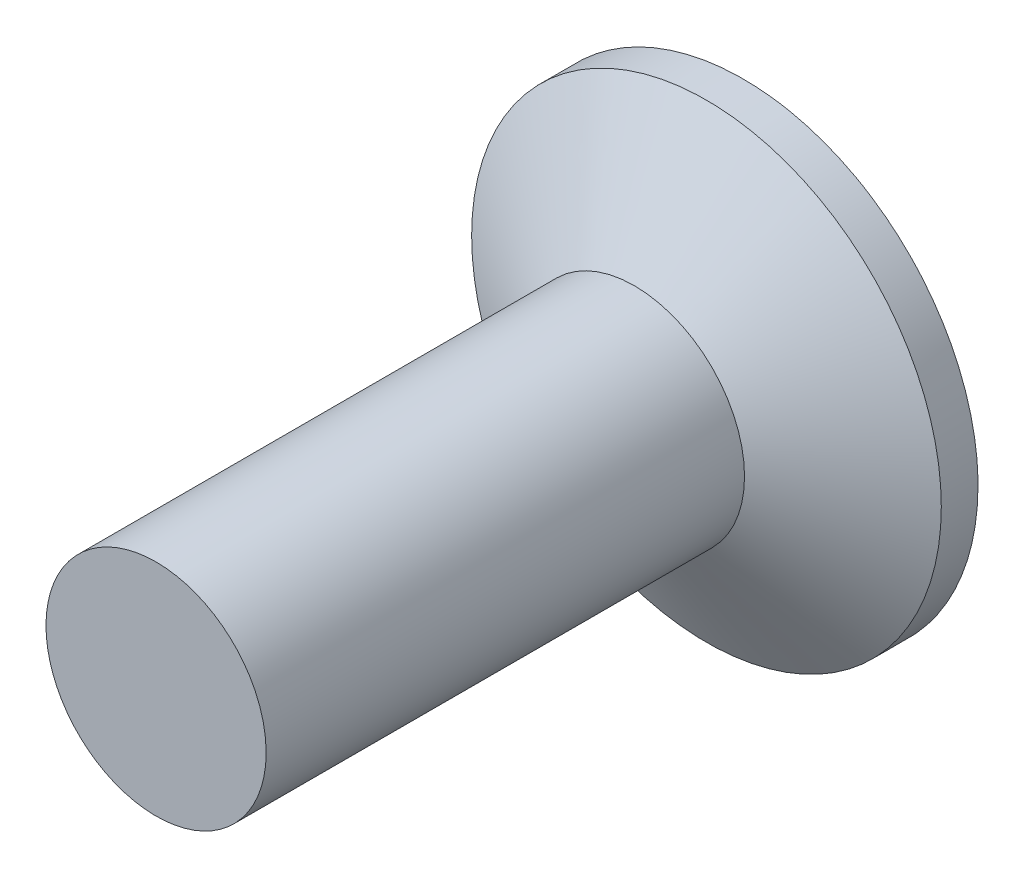
ISO-10303-21;
HEADER;
FILE_DESCRIPTION(('STEP AP214'),'2;1');
FILE_NAME('part.step','',(''),(''),'','','');
FILE_SCHEMA(('AUTOMOTIVE_DESIGN { 1 0 10303 214 1 1 1 1 }'));
ENDSEC;
DATA;
#1=APPLICATION_CONTEXT('core data for automotive mechanical design processes');
#2=APPLICATION_PROTOCOL_DEFINITION('international standard','automotive_design',2000,#1);
#3=PRODUCT_CONTEXT('',#1,'mechanical');
#4=PRODUCT('Part','Part','',(#3));
#5=PRODUCT_RELATED_PRODUCT_CATEGORY('part','',(#4));
#6=PRODUCT_DEFINITION_FORMATION('','',#4);
#7=PRODUCT_DEFINITION_CONTEXT('part definition',#1,'design');
#8=PRODUCT_DEFINITION('design','',#6,#7);
#9=PRODUCT_DEFINITION_SHAPE('','',#8);
#10=(LENGTH_UNIT() NAMED_UNIT(*) SI_UNIT(.MILLI.,.METRE.));
#11=(NAMED_UNIT(*) PLANE_ANGLE_UNIT() SI_UNIT($,.RADIAN.));
#12=(NAMED_UNIT(*) SI_UNIT($,.STERADIAN.) SOLID_ANGLE_UNIT());
#13=UNCERTAINTY_MEASURE_WITH_UNIT(LENGTH_MEASURE(1.E-05),#10,'distance_accuracy_value','');
#14=(GEOMETRIC_REPRESENTATION_CONTEXT(3) GLOBAL_UNCERTAINTY_ASSIGNED_CONTEXT((#13)) GLOBAL_UNIT_ASSIGNED_CONTEXT((#10,
#11,#12)) REPRESENTATION_CONTEXT('',''));
#15=CARTESIAN_POINT('',(0.,0.,0.));
#16=DIRECTION('',(0.,0.,1.));
#17=DIRECTION('',(1.,0.,0.));
#18=AXIS2_PLACEMENT_3D('',#15,#16,#17);
#19=CARTESIAN_POINT('',(1.25,-1.25,-7.));
#20=DIRECTION('',(0.,0.,-1.));
#21=DIRECTION('',(-1.,0.,0.));
#22=AXIS2_PLACEMENT_3D('',#19,#20,#21);
#23=PLANE('',#22);
#24=DIRECTION('',(1.,0.,0.));
#25=VECTOR('',#24,1.);
#26=CARTESIAN_POINT('',(-0.440139819,-1.25,-7.));
#27=LINE('',#26,#25);
#28=CARTESIAN_POINT('',(-0.4,-1.24999999999981,-7.));
#29=VERTEX_POINT('',#28);
#30=CARTESIAN_POINT('',(0.400000000000184,-1.25,-7.));
#31=VERTEX_POINT('',#30);
#32=EDGE_CURVE('E179',#29,#31,#27,.T.);
#33=ORIENTED_EDGE('',*,*,#32,.F.);
#34=DIRECTION('',(0.,1.,0.));
#35=VECTOR('',#34,1.);
#36=CARTESIAN_POINT('',(-0.4,-2.2611,-7.));
#37=LINE('',#36,#35);
#38=CARTESIAN_POINT('',(-0.4,-0.4,-7.));
#39=VERTEX_POINT('',#38);
#40=EDGE_CURVE('E187',#39,#29,#37,.F.);
#41=ORIENTED_EDGE('',*,*,#40,.F.);
#42=DIRECTION('',(1.,0.,0.));
#43=VECTOR('',#42,1.);
#44=CARTESIAN_POINT('',(-2.2611,-0.4,-7.));
#45=LINE('',#44,#43);
#46=CARTESIAN_POINT('',(-1.25,-0.400000000000184,-7.));
#47=VERTEX_POINT('',#46);
#48=EDGE_CURVE('E195',#47,#39,#45,.T.);
#49=ORIENTED_EDGE('',*,*,#48,.F.);
#50=DIRECTION('',(0.,1.,0.));
#51=VECTOR('',#50,1.);
#52=CARTESIAN_POINT('',(-1.25,-0.440139819,-7.));
#53=LINE('',#52,#51);
#54=CARTESIAN_POINT('',(-1.25,0.400000000000184,-7.));
#55=VERTEX_POINT('',#54);
#56=EDGE_CURVE('E112',#55,#47,#53,.F.);
#57=ORIENTED_EDGE('',*,*,#56,.F.);
#58=DIRECTION('',(1.,0.,0.));
#59=VECTOR('',#58,1.);
#60=CARTESIAN_POINT('',(-2.2611,0.4,-7.));
#61=LINE('',#60,#59);
#62=CARTESIAN_POINT('',(-0.4,0.4,-7.));
#63=VERTEX_POINT('',#62);
#64=EDGE_CURVE('E22',#63,#55,#61,.F.);
#65=ORIENTED_EDGE('',*,*,#64,.F.);
#66=DIRECTION('',(0.,1.,0.));
#67=VECTOR('',#66,1.);
#68=CARTESIAN_POINT('',(-0.4,0.3889,-7.));
#69=LINE('',#68,#67);
#70=CARTESIAN_POINT('',(-0.400000000000184,1.25,-7.));
#71=VERTEX_POINT('',#70);
#72=EDGE_CURVE('E109',#71,#63,#69,.F.);
#73=ORIENTED_EDGE('',*,*,#72,.F.);
#74=DIRECTION('',(1.,0.,0.));
#75=VECTOR('',#74,1.);
#76=CARTESIAN_POINT('',(-0.440139819,1.25,-7.));
#77=LINE('',#76,#75);
#78=CARTESIAN_POINT('',(0.4,1.24999999999981,-7.));
#79=VERTEX_POINT('',#78);
#80=EDGE_CURVE('E124',#79,#71,#77,.F.);
#81=ORIENTED_EDGE('',*,*,#80,.F.);
#82=DIRECTION('',(0.,1.,0.));
#83=VECTOR('',#82,1.);
#84=CARTESIAN_POINT('',(0.4,0.3889,-7.));
#85=LINE('',#84,#83);
#86=CARTESIAN_POINT('',(0.4,0.4,-7.));
#87=VERTEX_POINT('',#86);
#88=EDGE_CURVE('E139',#87,#79,#85,.T.);
#89=ORIENTED_EDGE('',*,*,#88,.F.);
#90=DIRECTION('',(1.,0.,0.));
#91=VECTOR('',#90,1.);
#92=CARTESIAN_POINT('',(0.3889,0.4,-7.));
#93=LINE('',#92,#91);
#94=CARTESIAN_POINT('',(1.25,0.400000000000184,-7.));
#95=VERTEX_POINT('',#94);
#96=EDGE_CURVE('E147',#95,#87,#93,.F.);
#97=ORIENTED_EDGE('',*,*,#96,.F.);
#98=DIRECTION('',(0.,1.,0.));
#99=VECTOR('',#98,1.);
#100=CARTESIAN_POINT('',(1.25,-0.440139819,-7.));
#101=LINE('',#100,#99);
#102=CARTESIAN_POINT('',(1.24999999999981,-0.4,-7.));
#103=VERTEX_POINT('',#102);
#104=EDGE_CURVE('E155',#103,#95,#101,.T.);
#105=ORIENTED_EDGE('',*,*,#104,.F.);
#106=DIRECTION('',(1.,0.,0.));
#107=VECTOR('',#106,1.);
#108=CARTESIAN_POINT('',(0.3889,-0.4,-7.));
#109=LINE('',#108,#107);
#110=CARTESIAN_POINT('',(0.4,-0.4,-7.));
#111=VERTEX_POINT('',#110);
#112=EDGE_CURVE('E163',#111,#103,#109,.T.);
#113=ORIENTED_EDGE('',*,*,#112,.F.);
#114=DIRECTION('',(0.,1.,0.));
#115=VECTOR('',#114,1.);
#116=CARTESIAN_POINT('',(0.4,-2.2611,-7.));
#117=LINE('',#116,#115);
#118=EDGE_CURVE('E171',#31,#111,#117,.T.);
#119=ORIENTED_EDGE('',*,*,#118,.F.);
#120=EDGE_LOOP('',(#33,#41,#49,#57,#65,#73,#81,#89,#97,#105,#113,#119));
#121=FACE_BOUND('',#120,.T.);
#122=ADVANCED_FACE('F17',(#121),#23,.T.);
#123=CARTESIAN_POINT('',(-2.2611,0.4,-7.));
#124=DIRECTION('',(0.,-0.999390827036237,-0.0348994962116514));
#125=DIRECTION('',(0.,0.0348994962116514,-0.999390827036237));
#126=AXIS2_PLACEMENT_3D('',#123,#124,#125);
#127=PLANE('',#126);
#128=ORIENTED_EDGE('',*,*,#64,.T.);
#129=DIRECTION('',(0.70689130758923,-0.0246851880604071,0.70689130758923));
#130=VECTOR('',#129,1.);
#131=CARTESIAN_POINT('',(-2.25000000000954,0.434920769000666,-8.00000000000954));
#132=LINE('',#131,#130);
#133=CARTESIAN_POINT('',(-2.25000000043532,0.434920769015452,-8.00000000043532));
#134=VERTEX_POINT('',#133);
#135=EDGE_CURVE('E202',#134,#55,#132,.T.);
#136=ORIENTED_EDGE('',*,*,#135,.F.);
#137=DIRECTION('',(1.,0.,0.));
#138=VECTOR('',#137,1.);
#139=CARTESIAN_POINT('',(-2.2611,0.43492076899688,-7.99999999991066));
#140=LINE('',#139,#138);
#141=CARTESIAN_POINT('',(-0.43492076899688,0.43492076899688,-7.99999999991066));
#142=VERTEX_POINT('',#141);
#143=EDGE_CURVE('E120',#134,#142,#140,.T.);
#144=ORIENTED_EDGE('',*,*,#143,.T.);
#145=DIRECTION('',(-0.0348782622524204,0.03487826225242,-0.998782765992937));
#146=VECTOR('',#145,1.);
#147=CARTESIAN_POINT('',(-0.400000000000558,0.400000000000559,-7.00000000001598));
#148=LINE('',#147,#146);
#149=EDGE_CURVE('E117',#63,#142,#148,.T.);
#150=ORIENTED_EDGE('',*,*,#149,.F.);
#151=EDGE_LOOP('',(#128,#136,#144,#150));
#152=FACE_BOUND('',#151,.T.);
#153=ADVANCED_FACE('F118',(#152),#127,.T.);
#154=CARTESIAN_POINT('',(-0.4,0.3889,-7.));
#155=DIRECTION('',(0.999390827036237,0.,-0.0348994962116514));
#156=DIRECTION('',(-0.0348994962116514,0.,-0.999390827036237));
#157=AXIS2_PLACEMENT_3D('',#154,#155,#156);
#158=PLANE('',#157);
#159=ORIENTED_EDGE('',*,*,#72,.T.);
#160=ORIENTED_EDGE('',*,*,#149,.T.);
#161=DIRECTION('',(0.,1.,0.));
#162=VECTOR('',#161,1.);
#163=CARTESIAN_POINT('',(-0.43492076899688,0.3889,-7.99999999991066));
#164=LINE('',#163,#162);
#165=CARTESIAN_POINT('',(-0.434920769015452,2.25000000043532,-8.00000000043532));
#166=VERTEX_POINT('',#165);
#167=EDGE_CURVE('E212',#142,#166,#164,.T.);
#168=ORIENTED_EDGE('',*,*,#167,.T.);
#169=DIRECTION('',(-0.0246851880604071,0.70689130758923,-0.70689130758923));
#170=VECTOR('',#169,1.);
#171=CARTESIAN_POINT('',(-0.400000000000735,1.25000000001053,-7.00000000001053));
#172=LINE('',#171,#170);
#173=EDGE_CURVE('E128',#71,#166,#172,.T.);
#174=ORIENTED_EDGE('',*,*,#173,.F.);
#175=EDGE_LOOP('',(#159,#160,#168,#174));
#176=FACE_BOUND('',#175,.T.);
#177=ADVANCED_FACE('F126',(#176),#158,.T.);
#178=CARTESIAN_POINT('',(-0.440139819,1.25,-7.));
#179=DIRECTION('',(0.,-0.707106781186548,-0.707106781186547));
#180=DIRECTION('',(0.,0.707106781186547,-0.707106781186548));
#181=AXIS2_PLACEMENT_3D('',#178,#179,#180);
#182=PLANE('',#181);
#183=ORIENTED_EDGE('',*,*,#80,.T.);
#184=ORIENTED_EDGE('',*,*,#173,.T.);
#185=DIRECTION('',(1.,0.,0.));
#186=VECTOR('',#185,1.);
#187=CARTESIAN_POINT('',(-0.440139819,2.25000000096,-8.00000000096));
#188=LINE('',#187,#186);
#189=CARTESIAN_POINT('',(0.434920769015204,2.25000000043515,-8.00000000043536));
#190=VERTEX_POINT('',#189);
#191=EDGE_CURVE('E215',#166,#190,#188,.T.);
#192=ORIENTED_EDGE('',*,*,#191,.T.);
#193=DIRECTION('',(0.0246851880604302,0.706891307589264,-0.706891307589195));
#194=VECTOR('',#193,1.);
#195=CARTESIAN_POINT('',(0.399999999989177,1.2499999996897,-6.99999999969008));
#196=LINE('',#195,#194);
#197=EDGE_CURVE('E143',#79,#190,#196,.T.);
#198=ORIENTED_EDGE('',*,*,#197,.F.);
#199=EDGE_LOOP('',(#183,#184,#192,#198));
#200=FACE_BOUND('',#199,.T.);
#201=ADVANCED_FACE('F437',(#200),#182,.T.);
#202=CARTESIAN_POINT('',(0.434920769,0.3889,-8.));
#203=DIRECTION('',(-0.999390827036237,0.,-0.0348994962116514));
#204=DIRECTION('',(-0.0348994962116514,0.,0.999390827036237));
#205=AXIS2_PLACEMENT_3D('',#202,#203,#204);
#206=PLANE('',#205);
#207=ORIENTED_EDGE('',*,*,#88,.T.);
#208=ORIENTED_EDGE('',*,*,#197,.T.);
#209=DIRECTION('',(0.,1.,0.));
#210=VECTOR('',#209,1.);
#211=CARTESIAN_POINT('',(0.43492076899688,0.3889,-7.99999999991066));
#212=LINE('',#211,#210);
#213=CARTESIAN_POINT('',(0.43492076899688,0.43492076899688,-7.99999999991066));
#214=VERTEX_POINT('',#213);
#215=EDGE_CURVE('E218',#190,#214,#212,.F.);
#216=ORIENTED_EDGE('',*,*,#215,.T.);
#217=DIRECTION('',(0.03487826225242,0.0348782622524204,-0.998782765992937));
#218=VECTOR('',#217,1.);
#219=CARTESIAN_POINT('',(0.400000000000559,0.400000000000558,-7.00000000001598));
#220=LINE('',#219,#218);
#221=EDGE_CURVE('E151',#87,#214,#220,.T.);
#222=ORIENTED_EDGE('',*,*,#221,.F.);
#223=EDGE_LOOP('',(#207,#208,#216,#222));
#224=FACE_BOUND('',#223,.T.);
#225=ADVANCED_FACE('F426',(#224),#206,.T.);
#226=CARTESIAN_POINT('',(0.3889,0.4,-7.));
#227=DIRECTION('',(0.,-0.999390827036237,-0.0348994962116514));
#228=DIRECTION('',(0.,0.0348994962116514,-0.999390827036237));
#229=AXIS2_PLACEMENT_3D('',#226,#227,#228);
#230=PLANE('',#229);
#231=ORIENTED_EDGE('',*,*,#96,.T.);
#232=ORIENTED_EDGE('',*,*,#221,.T.);
#233=DIRECTION('',(1.,0.,0.));
#234=VECTOR('',#233,1.);
#235=CARTESIAN_POINT('',(0.3889,0.43492076899688,-7.99999999991066));
#236=LINE('',#235,#234);
#237=CARTESIAN_POINT('',(2.25000000043532,0.434920769015452,-8.00000000043532));
#238=VERTEX_POINT('',#237);
#239=EDGE_CURVE('E221',#214,#238,#236,.T.);
#240=ORIENTED_EDGE('',*,*,#239,.T.);
#241=DIRECTION('',(0.70689130758923,0.0246851880604071,-0.70689130758923));
#242=VECTOR('',#241,1.);
#243=CARTESIAN_POINT('',(1.25000000001053,0.400000000000735,-7.00000000001053));
#244=LINE('',#243,#242);
#245=EDGE_CURVE('E159',#95,#238,#244,.T.);
#246=ORIENTED_EDGE('',*,*,#245,.F.);
#247=EDGE_LOOP('',(#231,#232,#240,#246));
#248=FACE_BOUND('',#247,.T.);
#249=ADVANCED_FACE('F415',(#248),#230,.T.);
#250=CARTESIAN_POINT('',(2.25,-0.440139819,-8.));
#251=DIRECTION('',(-0.707106781186548,0.,-0.707106781186547));
#252=DIRECTION('',(-0.707106781186547,0.,0.707106781186548));
#253=AXIS2_PLACEMENT_3D('',#250,#251,#252);
#254=PLANE('',#253);
#255=ORIENTED_EDGE('',*,*,#104,.T.);
#256=ORIENTED_EDGE('',*,*,#245,.T.);
#257=DIRECTION('',(0.,1.,0.));
#258=VECTOR('',#257,1.);
#259=CARTESIAN_POINT('',(2.25000000096,-0.440139819,-8.00000000096));
#260=LINE('',#259,#258);
#261=CARTESIAN_POINT('',(2.25000000043515,-0.434920769015204,-8.00000000043536));
#262=VERTEX_POINT('',#261);
#263=EDGE_CURVE('E224',#238,#262,#260,.F.);
#264=ORIENTED_EDGE('',*,*,#263,.T.);
#265=DIRECTION('',(0.706891307589264,-0.0246851880604302,-0.706891307589195));
#266=VECTOR('',#265,1.);
#267=CARTESIAN_POINT('',(1.2499999996897,-0.399999999989177,-6.99999999969008));
#268=LINE('',#267,#266);
#269=EDGE_CURVE('E167',#103,#262,#268,.T.);
#270=ORIENTED_EDGE('',*,*,#269,.F.);
#271=EDGE_LOOP('',(#255,#256,#264,#270));
#272=FACE_BOUND('',#271,.T.);
#273=ADVANCED_FACE('F404',(#272),#254,.T.);
#274=CARTESIAN_POINT('',(0.3889,-0.434920769,-8.));
#275=DIRECTION('',(0.,0.999390827036237,-0.0348994962116514));
#276=DIRECTION('',(0.,0.0348994962116514,0.999390827036237));
#277=AXIS2_PLACEMENT_3D('',#274,#275,#276);
#278=PLANE('',#277);
#279=ORIENTED_EDGE('',*,*,#112,.T.);
#280=ORIENTED_EDGE('',*,*,#269,.T.);
#281=DIRECTION('',(1.,0.,0.));
#282=VECTOR('',#281,1.);
#283=CARTESIAN_POINT('',(0.3889,-0.43492076899688,-7.99999999991066));
#284=LINE('',#283,#282);
#285=CARTESIAN_POINT('',(0.43492076899688,-0.43492076899688,-7.99999999991066));
#286=VERTEX_POINT('',#285);
#287=EDGE_CURVE('E227',#262,#286,#284,.F.);
#288=ORIENTED_EDGE('',*,*,#287,.T.);
#289=DIRECTION('',(0.0348782622524204,-0.0348782622524201,-0.998782765992937));
#290=VECTOR('',#289,1.);
#291=CARTESIAN_POINT('',(0.400000000000558,-0.400000000000559,-7.00000000001598));
#292=LINE('',#291,#290);
#293=EDGE_CURVE('E175',#111,#286,#292,.T.);
#294=ORIENTED_EDGE('',*,*,#293,.F.);
#295=EDGE_LOOP('',(#279,#280,#288,#294));
#296=FACE_BOUND('',#295,.T.);
#297=ADVANCED_FACE('F393',(#296),#278,.T.);
#298=CARTESIAN_POINT('',(0.434920769,-2.2611,-8.));
#299=DIRECTION('',(-0.999390827036237,0.,-0.0348994962116514));
#300=DIRECTION('',(-0.0348994962116514,0.,0.999390827036237));
#301=AXIS2_PLACEMENT_3D('',#298,#299,#300);
#302=PLANE('',#301);
#303=ORIENTED_EDGE('',*,*,#118,.T.);
#304=ORIENTED_EDGE('',*,*,#293,.T.);
#305=DIRECTION('',(0.,1.,0.));
#306=VECTOR('',#305,1.);
#307=CARTESIAN_POINT('',(0.43492076899688,-2.2611,-7.99999999991066));
#308=LINE('',#307,#306);
#309=CARTESIAN_POINT('',(0.434920769015452,-2.25000000043532,-8.00000000043532));
#310=VERTEX_POINT('',#309);
#311=EDGE_CURVE('E230',#286,#310,#308,.F.);
#312=ORIENTED_EDGE('',*,*,#311,.T.);
#313=DIRECTION('',(0.0246851880604071,-0.70689130758923,-0.70689130758923));
#314=VECTOR('',#313,1.);
#315=CARTESIAN_POINT('',(0.400000000000735,-1.25000000001053,-7.00000000001053));
#316=LINE('',#315,#314);
#317=EDGE_CURVE('E183',#31,#310,#316,.T.);
#318=ORIENTED_EDGE('',*,*,#317,.F.);
#319=EDGE_LOOP('',(#303,#304,#312,#318));
#320=FACE_BOUND('',#319,.T.);
#321=ADVANCED_FACE('F382',(#320),#302,.T.);
#322=CARTESIAN_POINT('',(-0.440139819,-2.25,-8.));
#323=DIRECTION('',(0.,0.707106781186548,-0.707106781186547));
#324=DIRECTION('',(0.,0.707106781186547,0.707106781186548));
#325=AXIS2_PLACEMENT_3D('',#322,#323,#324);
#326=PLANE('',#325);
#327=ORIENTED_EDGE('',*,*,#32,.T.);
#328=ORIENTED_EDGE('',*,*,#317,.T.);
#329=DIRECTION('',(1.,0.,0.));
#330=VECTOR('',#329,1.);
#331=CARTESIAN_POINT('',(-0.440139819,-2.25000000096,-8.00000000096));
#332=LINE('',#331,#330);
#333=CARTESIAN_POINT('',(-0.434920769015204,-2.25000000043515,-8.00000000043536));
#334=VERTEX_POINT('',#333);
#335=EDGE_CURVE('E233',#310,#334,#332,.F.);
#336=ORIENTED_EDGE('',*,*,#335,.T.);
#337=DIRECTION('',(-0.0246851880604302,-0.706891307589264,-0.706891307589195));
#338=VECTOR('',#337,1.);
#339=CARTESIAN_POINT('',(-0.399999999989177,-1.2499999996897,-6.99999999969008));
#340=LINE('',#339,#338);
#341=EDGE_CURVE('E191',#29,#334,#340,.T.);
#342=ORIENTED_EDGE('',*,*,#341,.F.);
#343=EDGE_LOOP('',(#327,#328,#336,#342));
#344=FACE_BOUND('',#343,.T.);
#345=ADVANCED_FACE('F371',(#344),#326,.T.);
#346=CARTESIAN_POINT('',(-0.4,-2.2611,-7.));
#347=DIRECTION('',(0.999390827036237,0.,-0.0348994962116514));
#348=DIRECTION('',(-0.0348994962116514,0.,-0.999390827036237));
#349=AXIS2_PLACEMENT_3D('',#346,#347,#348);
#350=PLANE('',#349);
#351=ORIENTED_EDGE('',*,*,#40,.T.);
#352=ORIENTED_EDGE('',*,*,#341,.T.);
#353=DIRECTION('',(0.,1.,0.));
#354=VECTOR('',#353,1.);
#355=CARTESIAN_POINT('',(-0.43492076899688,-2.2611,-7.99999999991066));
#356=LINE('',#355,#354);
#357=CARTESIAN_POINT('',(-0.43492076899688,-0.43492076899688,-7.99999999991066));
#358=VERTEX_POINT('',#357);
#359=EDGE_CURVE('E236',#334,#358,#356,.T.);
#360=ORIENTED_EDGE('',*,*,#359,.T.);
#361=DIRECTION('',(-0.0348782622524201,-0.0348782622524204,-0.998782765992937));
#362=VECTOR('',#361,1.);
#363=CARTESIAN_POINT('',(-0.400000000000559,-0.400000000000558,-7.00000000001598));
#364=LINE('',#363,#362);
#365=EDGE_CURVE('E199',#39,#358,#364,.T.);
#366=ORIENTED_EDGE('',*,*,#365,.F.);
#367=EDGE_LOOP('',(#351,#352,#360,#366));
#368=FACE_BOUND('',#367,.T.);
#369=ADVANCED_FACE('F361',(#368),#350,.T.);
#370=CARTESIAN_POINT('',(-2.2611,-0.434920769,-8.));
#371=DIRECTION('',(0.,0.999390827036237,-0.0348994962116514));
#372=DIRECTION('',(0.,0.0348994962116514,0.999390827036237));
#373=AXIS2_PLACEMENT_3D('',#370,#371,#372);
#374=PLANE('',#373);
#375=ORIENTED_EDGE('',*,*,#48,.T.);
#376=ORIENTED_EDGE('',*,*,#365,.T.);
#377=DIRECTION('',(1.,0.,0.));
#378=VECTOR('',#377,1.);
#379=CARTESIAN_POINT('',(-2.2611,-0.43492076899688,-7.99999999991066));
#380=LINE('',#379,#378);
#381=CARTESIAN_POINT('',(-2.25000000043532,-0.434920769015452,-8.00000000043532));
#382=VERTEX_POINT('',#381);
#383=EDGE_CURVE('E38',#358,#382,#380,.F.);
#384=ORIENTED_EDGE('',*,*,#383,.T.);
#385=DIRECTION('',(-0.70689130758923,-0.0246851880604071,-0.70689130758923));
#386=VECTOR('',#385,1.);
#387=CARTESIAN_POINT('',(-1.25000000001053,-0.400000000000735,-7.00000000001053));
#388=LINE('',#387,#386);
#389=EDGE_CURVE('E207',#47,#382,#388,.T.);
#390=ORIENTED_EDGE('',*,*,#389,.F.);
#391=EDGE_LOOP('',(#375,#376,#384,#390));
#392=FACE_BOUND('',#391,.T.);
#393=ADVANCED_FACE('F350',(#392),#374,.T.);
#394=CARTESIAN_POINT('',(-1.25,-0.440139819,-7.));
#395=DIRECTION('',(0.707106781186548,0.,-0.707106781186547));
#396=DIRECTION('',(-0.707106781186547,0.,-0.707106781186548));
#397=AXIS2_PLACEMENT_3D('',#394,#395,#396);
#398=PLANE('',#397);
#399=ORIENTED_EDGE('',*,*,#56,.T.);
#400=ORIENTED_EDGE('',*,*,#389,.T.);
#401=DIRECTION('',(0.,1.,0.));
#402=VECTOR('',#401,1.);
#403=CARTESIAN_POINT('',(-2.25000000096,-0.440139819,-8.00000000096));
#404=LINE('',#403,#402);
#405=EDGE_CURVE('E241',#382,#134,#404,.T.);
#406=ORIENTED_EDGE('',*,*,#405,.T.);
#407=ORIENTED_EDGE('',*,*,#135,.T.);
#408=EDGE_LOOP('',(#399,#400,#406,#407));
#409=FACE_BOUND('',#408,.T.);
#410=ADVANCED_FACE('F330',(#409),#398,.T.);
#411=CARTESIAN_POINT('',(-3.2384,-3.2384,-8.));
#412=DIRECTION('',(0.,0.,1.));
#413=DIRECTION('',(1.,0.,0.));
#414=AXIS2_PLACEMENT_3D('',#411,#412,#413);
#415=PLANE('',#414);
#416=ORIENTED_EDGE('',*,*,#383,.F.);
#417=ORIENTED_EDGE('',*,*,#359,.F.);
#418=ORIENTED_EDGE('',*,*,#335,.F.);
#419=ORIENTED_EDGE('',*,*,#311,.F.);
#420=ORIENTED_EDGE('',*,*,#287,.F.);
#421=ORIENTED_EDGE('',*,*,#263,.F.);
#422=ORIENTED_EDGE('',*,*,#239,.F.);
#423=ORIENTED_EDGE('',*,*,#215,.F.);
#424=ORIENTED_EDGE('',*,*,#191,.F.);
#425=ORIENTED_EDGE('',*,*,#167,.F.);
#426=ORIENTED_EDGE('',*,*,#143,.F.);
#427=ORIENTED_EDGE('',*,*,#405,.F.);
#428=EDGE_LOOP('',(#416,#417,#418,#419,#420,#421,#422,#423,#424,#425,#426,#427));
#429=FACE_BOUND('',#428,.T.);
#430=CARTESIAN_POINT('',(-3.2,-8.75108304731578E-10,-8.));
#431=CARTESIAN_POINT('',(-3.19999984525004,0.0846791863644175,-8.));
#432=CARTESIAN_POINT('',(-3.19663668450986,0.169361636344775,-8.));
#433=CARTESIAN_POINT('',(-3.183204827809,0.338203412008162,-8.));
#434=CARTESIAN_POINT('',(-3.17313508443994,0.422362653906021,-8.));
#435=CARTESIAN_POINT('',(-3.14633491914527,0.589713862698114,-8.));
#436=CARTESIAN_POINT('',(-3.12959721783843,0.672904669862015,-8.));
#437=CARTESIAN_POINT('',(-3.08956318292945,0.83773887714193,-8.));
#438=CARTESIAN_POINT('',(-3.06626197857292,0.919381079836477,-8.));
#439=CARTESIAN_POINT('',(-2.98679185625932,1.16091773329018,-8.));
#440=CARTESIAN_POINT('',(-2.92100226159444,1.31775856997783,-8.));
#441=CARTESIAN_POINT('',(-2.76539962041665,1.61904813748785,-8.));
#442=CARTESIAN_POINT('',(-2.6755839656687,1.76349552064459,-8.));
#443=CARTESIAN_POINT('',(-2.5215604716276,1.97227196741618,-8.));
#444=CARTESIAN_POINT('',(-2.46508135066165,2.04241992880516,-8.));
#445=CARTESIAN_POINT('',(-2.34645532476992,2.17766476701007,-8.));
#446=CARTESIAN_POINT('',(-2.28431336912342,2.24276596427875,-8.));
#447=CARTESIAN_POINT('',(-2.15472976021935,2.3675372900551,-8.));
#448=CARTESIAN_POINT('',(-2.08728521532328,2.42720441640709,-8.));
#449=CARTESIAN_POINT('',(-1.94761726390899,2.5406484385297,-8.));
#450=CARTESIAN_POINT('',(-1.87539286087006,2.59442409978328,-8.));
#451=CARTESIAN_POINT('',(-1.65233949439999,2.74627865197905,-8.));
#452=CARTESIAN_POINT('',(-1.49498794915848,2.83502199354484,-8.));
#453=CARTESIAN_POINT('',(-1.16770862890479,2.98477584912471,-8.));
#454=CARTESIAN_POINT('',(-0.997781345360795,3.0457874462489,-8.));
#455=CARTESIAN_POINT('',(-0.650072087515443,3.13843271987964,-8.));
#456=CARTESIAN_POINT('',(-0.472289979597575,3.17006589643527,-8.));
#457=CARTESIAN_POINT('',(-0.113937408000419,3.20302891299845,-8.));
#458=CARTESIAN_POINT('',(0.0666330696910646,3.20435860067442,-8.));
#459=CARTESIAN_POINT('',(0.425412285287806,3.1766986290034,-8.));
#460=CARTESIAN_POINT('',(0.603621037633741,3.14770915512842,-8.));
#461=CARTESIAN_POINT('',(0.952727170097578,3.06017134111305,-8.));
#462=CARTESIAN_POINT('',(1.1236244975075,3.00162278792054,-8.));
#463=CARTESIAN_POINT('',(1.37062911572051,2.89301045408224,-8.));
#464=CARTESIAN_POINT('',(1.45144647144706,2.85331550763776,-8.));
#465=CARTESIAN_POINT('',(1.60945417724931,2.7672616179373,-8.));
#466=CARTESIAN_POINT('',(1.68664536181441,2.72090421797653,-8.));
#467=CARTESIAN_POINT('',(1.83681299137271,2.62187045762943,-8.));
#468=CARTESIAN_POINT('',(1.90979125116749,2.56919684862443,-8.));
#469=CARTESIAN_POINT('',(2.05110986010195,2.45785620577202,-8.));
#470=CARTESIAN_POINT('',(2.11944567108347,2.39918344395976,-8.));
#471=CARTESIAN_POINT('',(2.31657264529379,2.21489855479154,-8.));
#472=CARTESIAN_POINT('',(2.43768420045432,2.08088708377243,-8.));
#473=CARTESIAN_POINT('',(2.65564900677017,1.79441378715886,-8.));
#474=CARTESIAN_POINT('',(2.75250300664237,1.64195253123816,-8.));
#475=CARTESIAN_POINT('',(2.877573456043,1.4027533364518,-8.));
#476=CARTESIAN_POINT('',(2.91592640446954,1.32117289151915,-8.));
#477=CARTESIAN_POINT('',(2.98559744721644,1.15511793382554,-8.));
#478=CARTESIAN_POINT('',(3.01692141646407,1.07064590647546,-8.));
#479=CARTESIAN_POINT('',(3.07229981382065,0.899477138190644,-8.));
#480=CARTESIAN_POINT('',(3.09636341516206,0.812783355982363,-8.));
#481=CARTESIAN_POINT('',(3.13710470058824,0.637690791031622,-8.));
#482=CARTESIAN_POINT('',(3.15378387319875,0.549292355659339,-8.));
#483=CARTESIAN_POINT('',(3.17779066587543,0.384157675594623,-8.));
#484=CARTESIAN_POINT('',(3.18611557914713,0.307564656253998,-8.));
#485=CARTESIAN_POINT('',(3.19722012487431,0.153981971772259,-8.));
#486=CARTESIAN_POINT('',(3.20000014072801,0.0769923344241154,-8.));
#487=CARTESIAN_POINT('',(3.19999984522181,-0.0846791874314702,-8.));
#488=CARTESIAN_POINT('',(3.19663668445338,-0.169361637410942,-8.));
#489=CARTESIAN_POINT('',(3.18320482769616,-0.338203413070272,-8.));
#490=CARTESIAN_POINT('',(3.173135084299,-0.422362654964959,-8.));
#491=CARTESIAN_POINT('',(3.14633491894848,-0.58971386374804,-8.));
#492=CARTESIAN_POINT('',(3.12959721761393,-0.672904670906101,-8.));
#493=CARTESIAN_POINT('',(3.08956318265009,-0.837738878172202,-8.));
#494=CARTESIAN_POINT('',(3.0662619782664,-0.91938108085877,-8.));
#495=CARTESIAN_POINT('',(2.98679185587234,-1.16091773428579,-8.));
#496=CARTESIAN_POINT('',(2.92100226115518,-1.31775857095151,-8.));
#497=CARTESIAN_POINT('',(2.76539961987696,-1.61904813840966,-8.));
#498=CARTESIAN_POINT('',(2.67558396508087,-1.76349552153646,-8.));
#499=CARTESIAN_POINT('',(2.52156047097017,-1.97227196825671,-8.));
#500=CARTESIAN_POINT('',(2.46508134998083,-2.04241992962688,-8.));
#501=CARTESIAN_POINT('',(2.346455324044,-2.17766476779226,-8.));
#502=CARTESIAN_POINT('',(2.28431336837579,-2.24276596504023,-8.));
#503=CARTESIAN_POINT('',(2.15472975943012,-2.36753729077339,-8.));
#504=CARTESIAN_POINT('',(2.08728521451417,-2.42720441710288,-8.));
#505=CARTESIAN_POINT('',(1.94761726306209,-2.54064843917892,-8.));
#506=CARTESIAN_POINT('',(1.87539286000524,-2.59442410040842,-8.));
#507=CARTESIAN_POINT('',(1.65233949348457,-2.74627865252982,-8.));
#508=CARTESIAN_POINT('',(1.49498794821348,-2.83502199404317,-8.));
#509=CARTESIAN_POINT('',(1.16770862790988,-2.98477584951394,-8.));
#510=CARTESIAN_POINT('',(0.997781344345537,-3.0457874465815,-8.));
#511=CARTESIAN_POINT('',(0.650072086469299,-3.13843272009633,-8.));
#512=CARTESIAN_POINT('',(0.472289978540886,-3.1700658965927,-8.));
#513=CARTESIAN_POINT('',(0.113937406932742,-3.20302891303643,-8.));
#514=CARTESIAN_POINT('',(-0.0666330707591834,-3.20435860065221,-8.));
#515=CARTESIAN_POINT('',(-0.4254122863467,-3.1766986288616,-8.));
#516=CARTESIAN_POINT('',(-0.603621038682968,-3.14770915492722,-8.));
#517=CARTESIAN_POINT('',(-0.952727171117624,-3.06017134079548,-8.));
#518=CARTESIAN_POINT('',(-1.12362449850804,-3.001622787546,-8.));
#519=CARTESIAN_POINT('',(-1.37062911668485,-2.89301045362536,-8.));
#520=CARTESIAN_POINT('',(-1.45144647239819,-2.85331550715393,-8.));
#521=CARTESIAN_POINT('',(-1.60945417817178,-2.76726161740079,-8.));
#522=CARTESIAN_POINT('',(-1.68664536272143,-2.72090421741428,-8.));
#523=CARTESIAN_POINT('',(-1.83681299224672,-2.62187045701712,-8.));
#524=CARTESIAN_POINT('',(-1.90979125202393,-2.5691968479878,-8.));
#525=CARTESIAN_POINT('',(-2.05110986092125,-2.4578562050883,-8.));
#526=CARTESIAN_POINT('',(-2.1194456718832,-2.39918344325327,-8.));
#527=CARTESIAN_POINT('',(-2.3165726460321,-2.21489855401935,-8.));
#528=CARTESIAN_POINT('',(-2.43768420114796,-2.08088708295985,-8.));
#529=CARTESIAN_POINT('',(-2.65564900736832,-1.79441378627363,-8.));
#530=CARTESIAN_POINT('',(-2.75250300718969,-1.64195253032065,-8.));
#531=CARTESIAN_POINT('',(-2.8775734565107,-1.4027533354924,-8.));
#532=CARTESIAN_POINT('',(-2.91592640491014,-1.32117289054673,-8.));
#533=CARTESIAN_POINT('',(-2.98559744760186,-1.15511793282939,-8.));
#534=CARTESIAN_POINT('',(-3.0169214168214,-1.07064590546858,-8.));
#535=CARTESIAN_POINT('',(-3.07229981412087,-0.899477137165202,-8.));
#536=CARTESIAN_POINT('',(-3.09636341543328,-0.812783354949097,-8.));
#537=CARTESIAN_POINT('',(-3.13710470080093,-0.637690789985231,-8.));
#538=CARTESIAN_POINT('',(-3.1537838733819,-0.549292354607646,-8.));
#539=CARTESIAN_POINT('',(-3.17779066595234,-0.384157674887185,-8.));
#540=CARTESIAN_POINT('',(-3.18611557917276,-0.307564655899385,-8.));
#541=CARTESIAN_POINT('',(-3.19722012484866,-0.153981972126964,-8.));
#542=CARTESIAN_POINT('',(-3.20000014070235,-0.0769923351353147,-8.));
#543=CARTESIAN_POINT('',(-3.2,-8.75108304731578E-10,-8.));
#544=B_SPLINE_CURVE_WITH_KNOTS('',3,(#430,#431,#432,#433,#434,#435,#436,#437,#438,#439,#440,
#441,#442,#443,#444,#445,#446,#447,#448,#449,#450,#451,#452,#453,#454,#455,#456,#457,#458,#459,
#460,#461,#462,#463,#464,#465,#466,#467,#468,#469,#470,#471,#472,#473,#474,#475,#476,#477,#478,
#479,#480,#481,#482,#483,#484,#485,#486,#487,#488,#489,#490,#491,#492,#493,#494,#495,#496,#497,
#498,#499,#500,#501,#502,#503,#504,#505,#506,#507,#508,#509,#510,#511,#512,#513,#514,#515,#516,
#517,#518,#519,#520,#521,#522,#523,#524,#525,#526,#527,#528,#529,#530,#531,#532,#533,#534,#535,
#536,#537,#538,#539,#540,#541,#542,#543),.UNSPECIFIED.,.T.,.F.,(4,2,2,2,2,2,2,2,2,2,2,2,2,2,2,2,
2,2,2,2,2,2,2,2,2,2,2,2,2,2,2,2,2,2,2,2,2,2,2,2,2,2,2,2,2,2,2,2,2,2,2,2,2,2,2,2,4),(0.,
0.253975991229966,0.507991656761346,0.762285393382642,1.01676833999108,1.5247237861813,
2.03273439768868,2.30263673958591,2.57230541058497,2.84212217268263,3.11199536537089,
3.65115660964368,4.19029679425352,4.72944615358011,5.26859822313759,5.80774699454843,
6.34689965202164,6.61675526717275,6.88654847323807,7.15622457968437,7.42616061969185,
7.96531965581352,8.50446204857503,8.77463213141161,9.04457555386968,9.31417646964861,
9.58372301550472,9.81466000653351,10.0455810290251,10.2995570202559,10.5535726857878,
10.8078664224084,11.0623493690161,11.5703048152064,12.0783154267137,12.348217768611,
12.6178864396101,12.8877032017077,13.1575763943959,13.6967376386687,14.2358778232786,
14.7750271826052,15.3141792521626,15.8533280235735,16.3924806810467,16.6623362961978,
16.9321295022632,17.2018056087095,17.4717416487169,18.0109006848386,18.5500430776001,
18.8202131604374,19.0901565828963,19.3597574986747,19.6293040445298,19.8602410344925,
20.0911620559182),.UNSPECIFIED.);
#545=CARTESIAN_POINT('',(-3.2,-8.75108304731578E-10,-8.));
#546=VERTEX_POINT('',#545);
#547=EDGE_CURVE('E245',#546,#546,#544,.T.);
#548=ORIENTED_EDGE('',*,*,#547,.T.);
#549=EDGE_LOOP('',(#548));
#550=FACE_BOUND('',#549,.T.);
#551=ADVANCED_FACE('F255',(#429,#550),#415,.F.);
#552=CARTESIAN_POINT('',(3.2,0.,-8.));
#553=CARTESIAN_POINT('',(3.2,0.,-7.5));
#554=(BOUNDED_CURVE() B_SPLINE_CURVE(1,(#552,#553),.UNSPECIFIED.,.F.,
.F.) B_SPLINE_CURVE_WITH_KNOTS((2,2),(0.,1.),
.UNSPECIFIED.) CURVE() GEOMETRIC_REPRESENTATION_ITEM() RATIONAL_B_SPLINE_CURVE((1.,1.)) REPRESENTATION_ITEM(''));
#555=CARTESIAN_POINT('',(0.,0.,0.));
#556=DIRECTION('',(0.,0.,1.));
#557=AXIS1_PLACEMENT('',#555,#556);
#558=SURFACE_OF_REVOLUTION('',#554,#557);
#559=ORIENTED_EDGE('',*,*,#547,.F.);
#560=EDGE_LOOP('',(#559));
#561=FACE_BOUND('',#560,.T.);
#562=CARTESIAN_POINT('',(0.,0.,-7.5));
#563=DIRECTION('',(0.,0.,1.));
#564=DIRECTION('',(1.,0.,0.));
#565=AXIS2_PLACEMENT_3D('',#562,#563,#564);
#566=CIRCLE('',#565,3.2);
#567=CARTESIAN_POINT('',(3.2,0.,-7.5));
#568=VERTEX_POINT('',#567);
#569=EDGE_CURVE('E253',#568,#568,#566,.F.);
#570=ORIENTED_EDGE('',*,*,#569,.T.);
#571=EDGE_LOOP('',(#570));
#572=FACE_BOUND('',#571,.T.);
#573=ADVANCED_FACE('F258',(#561,#572),#558,.T.);
#574=CARTESIAN_POINT('',(1.518,-1.518,0.));
#575=DIRECTION('',(0.,0.,-1.));
#576=DIRECTION('',(-1.,0.,0.));
#577=AXIS2_PLACEMENT_3D('',#574,#575,#576);
#578=PLANE('',#577);
#579=CARTESIAN_POINT('',(1.5,-8.97925410904633E-11,0.));
#580=CARTESIAN_POINT('',(1.49999523299253,0.084192985188565,0.));
#581=CARTESIAN_POINT('',(1.49287252864952,0.168535810138729,0.));
#582=CARTESIAN_POINT('',(1.47167805290988,0.293182657123583,0.));
#583=CARTESIAN_POINT('',(1.46284300917088,0.334473199490456,0.));
#584=CARTESIAN_POINT('',(1.44171955640208,0.416204028583571,0.));
#585=CARTESIAN_POINT('',(1.42942834494476,0.456643596578477,0.));
#586=CARTESIAN_POINT('',(1.38753954374297,0.576047935176186,0.));
#587=CARTESIAN_POINT('',(1.35289238241872,0.653299317673834,0.));
#588=CARTESIAN_POINT('',(1.27110354285996,0.800882714979982,0.));
#589=CARTESIAN_POINT('',(1.22396138965583,0.871214466614557,0.));
#590=CARTESIAN_POINT('',(1.14494365045502,0.969994722158677,0.));
#591=CARTESIAN_POINT('',(1.11719945492947,1.00182052091477,0.));
#592=CARTESIAN_POINT('',(1.05915984685303,1.06299428684495,0.));
#593=CARTESIAN_POINT('',(1.02886691985023,1.09234461343706,0.));
#594=CARTESIAN_POINT('',(0.93440721267598,1.17642545956341,0.));
#595=CARTESIAN_POINT('',(0.866642380223135,1.22720721197991,0.));
#596=CARTESIAN_POINT('',(0.723585814792356,1.31664307588222,0.));
#597=CARTESIAN_POINT('',(0.648294365772946,1.35529764466575,0.));
#598=CARTESIAN_POINT('',(0.49228221233305,1.41942487651837,0.));
#599=CARTESIAN_POINT('',(0.411561565909333,1.44489768037485,0.));
#600=CARTESIAN_POINT('',(0.24699133510277,1.48192791685221,0.));
#601=CARTESIAN_POINT('',(0.163141734012445,1.49348527515871,0.));
#602=CARTESIAN_POINT('',(-0.00530769667311245,1.50235991721308,0.));
#603=CARTESIAN_POINT('',(-0.0899075262683439,1.49967720096096,0.));
#604=CARTESIAN_POINT('',(-0.257457736372596,1.48014450080668,0.));
#605=CARTESIAN_POINT('',(-0.340408125687876,1.46329459256309,0.));
#606=CARTESIAN_POINT('',(-0.502294905180735,1.41591564669614,0.));
#607=CARTESIAN_POINT('',(-0.581231252476125,1.38538646297065,0.));
#608=CARTESIAN_POINT('',(-0.73289351913653,1.31147765743149,0.));
#609=CARTESIAN_POINT('',(-0.805619204166447,1.26809755101415,0.));
#610=CARTESIAN_POINT('',(-0.90839095126327,1.19440770800011,0.));
#611=CARTESIAN_POINT('',(-0.941600222663529,1.16840295092521,0.));
#612=CARTESIAN_POINT('',(-1.00574648249775,1.11366646315854,0.));
#613=CARTESIAN_POINT('',(-1.03668124706387,1.08493212493643,0.));
#614=CARTESIAN_POINT('',(-1.1256410808193,0.995001651947711,0.));
#615=CARTESIAN_POINT('',(-1.17991250642459,0.930012804754694,0.));
#616=CARTESIAN_POINT('',(-1.27675618599589,0.791840538493026,0.));
#617=CARTESIAN_POINT('',(-1.31932888464861,0.718657431049761,0.));
#618=CARTESIAN_POINT('',(-1.37353243881864,0.604315651907628,0.));
#619=CARTESIAN_POINT('',(-1.39000487433328,0.565391476811549,0.));
#620=CARTESIAN_POINT('',(-1.41959941708146,0.486332690325721,0.));
#621=CARTESIAN_POINT('',(-1.43272423570646,0.446199088159058,0.));
#622=CARTESIAN_POINT('',(-1.4668988931538,0.3244693257609,0.));
#623=CARTESIAN_POINT('',(-1.48284465492017,0.241341847034369,0.));
#624=CARTESIAN_POINT('',(-1.49446404091687,0.131433795435493,0.));
#625=CARTESIAN_POINT('',(-1.49653823375947,0.105193578547154,0.));
#626=CARTESIAN_POINT('',(-1.49930695863862,0.0526404582928704,0.));
#627=CARTESIAN_POINT('',(-1.50000149067517,0.026327554926925,0.));
#628=CARTESIAN_POINT('',(-1.49999523296445,-0.084192985689028,0.));
#629=CARTESIAN_POINT('',(-1.49287252859329,-0.168535810636863,0.));
#630=CARTESIAN_POINT('',(-1.47167805281204,-0.293182657614683,0.));
#631=CARTESIAN_POINT('',(-1.46284300905928,-0.3344731999785,0.));
#632=CARTESIAN_POINT('',(-1.44171955626329,-0.416204029064354,0.));
#633=CARTESIAN_POINT('',(-1.42942834479251,-0.456643597055056,0.));
#634=CARTESIAN_POINT('',(-1.38753954355095,-0.576047935638699,0.));
#635=CARTESIAN_POINT('',(-1.35289238220095,-0.653299318124806,0.));
#636=CARTESIAN_POINT('',(-1.271103542593,-0.800882715403693,0.));
#637=CARTESIAN_POINT('',(-1.22396138936542,-0.871214467022548,0.));
#638=CARTESIAN_POINT('',(-1.14494365013169,-0.969994722540328,0.));
#639=CARTESIAN_POINT('',(-1.11719945459553,-1.00182052128718,0.));
#640=CARTESIAN_POINT('',(-1.05915984649868,-1.06299428719802,0.));
#641=CARTESIAN_POINT('',(-1.0288669194861,-1.09234461378003,0.));
#642=CARTESIAN_POINT('',(-0.934407212283817,-1.17642545987489,0.));
#643=CARTESIAN_POINT('',(-0.866642379814056,-1.22720721226879,0.));
#644=CARTESIAN_POINT('',(-0.723585814353479,-1.31664307612341,0.));
#645=CARTESIAN_POINT('',(-0.648294365321186,-1.35529764488185,0.));
#646=CARTESIAN_POINT('',(-0.492282211859915,-1.41942487668246,0.));
#647=CARTESIAN_POINT('',(-0.411561565427704,-1.44489768051203,0.));
#648=CARTESIAN_POINT('',(-0.246991334608794,-1.48192791693454,0.));
#649=CARTESIAN_POINT('',(-0.163141733514616,-1.49348527521309,0.));
#650=CARTESIAN_POINT('',(0.0053076971738995,-1.50235991721131,0.));
#651=CARTESIAN_POINT('',(0.089907526768236,-1.49967720093099,0.));
#652=CARTESIAN_POINT('',(0.257457736865974,-1.48014450072086,0.));
#653=CARTESIAN_POINT('',(0.340408126175634,-1.46329459244962,0.));
#654=CARTESIAN_POINT('',(0.502294905652701,-1.41591564652871,0.));
#655=CARTESIAN_POINT('',(0.581231252937917,-1.38538646277691,0.));
#656=CARTESIAN_POINT('',(0.7328935195737,-1.31147765718719,0.));
#657=CARTESIAN_POINT('',(0.805619204589169,-1.2680975507456,0.));
#658=CARTESIAN_POINT('',(0.908390951661432,-1.19440770769729,0.));
#659=CARTESIAN_POINT('',(0.941600223053017,-1.16840295061133,0.));
#660=CARTESIAN_POINT('',(1.00574648286898,-1.11366646282329,0.));
#661=CARTESIAN_POINT('',(1.03668124742551,-1.08493212459086,0.));
#662=CARTESIAN_POINT('',(1.12564108115097,-0.995001651572495,0.));
#663=CARTESIAN_POINT('',(1.17991250673461,-0.930012804361381,0.));
#664=CARTESIAN_POINT('',(1.27675618625984,-0.791840538067433,0.));
#665=CARTESIAN_POINT('',(1.31932888488816,-0.718657430609984,0.));
#666=CARTESIAN_POINT('',(1.37353243902013,-0.604315651449686,0.));
#667=CARTESIAN_POINT('',(1.39000487452182,-0.565391476348012,0.));
#668=CARTESIAN_POINT('',(1.41959941724372,-0.486332689852105,0.));
#669=CARTESIAN_POINT('',(1.43272423585537,-0.446199087680957,0.));
#670=CARTESIAN_POINT('',(1.46689889326205,-0.324469325271431,0.));
#671=CARTESIAN_POINT('',(1.48284465500069,-0.241341846539628,0.));
#672=CARTESIAN_POINT('',(1.49446404094314,-0.131433795103176,0.));
#673=CARTESIAN_POINT('',(1.49653823376824,-0.105193578380766,0.));
#674=CARTESIAN_POINT('',(1.49930695862986,-0.0526404584592591,0.));
#675=CARTESIAN_POINT('',(1.50000149066638,-0.0263275552601629,0.));
#676=CARTESIAN_POINT('',(1.5,-8.97925410904633E-11,0.));
#677=B_SPLINE_CURVE_WITH_KNOTS('',3,(#579,#580,#581,#582,#583,#584,#585,#586,#587,#588,#589,
#590,#591,#592,#593,#594,#595,#596,#597,#598,#599,#600,#601,#602,#603,#604,#605,#606,#607,#608,
#609,#610,#611,#612,#613,#614,#615,#616,#617,#618,#619,#620,#621,#622,#623,#624,#625,#626,#627,
#628,#629,#630,#631,#632,#633,#634,#635,#636,#637,#638,#639,#640,#641,#642,#643,#644,#645,#646,
#647,#648,#649,#650,#651,#652,#653,#654,#655,#656,#657,#658,#659,#660,#661,#662,#663,#664,#665,
#666,#667,#668,#669,#670,#671,#672,#673,#674,#675,#676),.UNSPECIFIED.,.T.,.F.,(4,2,2,2,2,2,2,2,
2,2,2,2,2,2,2,2,2,2,2,2,2,2,2,2,2,2,2,2,2,2,2,2,2,2,2,2,2,2,2,2,2,2,2,2,2,2,2,2,4),(0.,
0.252456446608815,0.379016468560579,0.505679408880953,0.758401502249154,1.01113320366972,
1.13766464085231,1.26407408267186,1.51681186122693,1.76954010827729,2.0222656560163,
2.27499255341101,2.52771945080572,2.78044499854473,3.03317324559509,3.28591102415012,
3.41232046596969,3.5388519031523,3.79158360457285,4.04430569794107,4.17096863826112,
4.2975286602125,4.54998510682202,4.62892946360324,4.70787382038447,4.96033026699398,
5.08689028894537,5.21355322926542,5.46627532263364,5.71900702405419,5.8455384612368,
5.97194790305637,6.2246856816114,6.47741392866175,6.73013947640077,6.98286637379548,
7.23559327119019,7.4883188189292,7.74104706597956,7.99378484453463,8.12019428635418,
8.24672572353677,8.49945742495733,8.75217951832554,8.87884245864591,9.00540248059767,
9.25785892720649,9.33680328348789,9.41574763976929),.UNSPECIFIED.);
#678=CARTESIAN_POINT('',(1.5,-8.97925410904633E-11,0.));
#679=VERTEX_POINT('',#678);
#680=EDGE_CURVE('E29',#679,#679,#677,.T.);
#681=ORIENTED_EDGE('',*,*,#680,.T.);
#682=EDGE_LOOP('',(#681));
#683=FACE_BOUND('',#682,.T.);
#684=ADVANCED_FACE('F19',(#683),#578,.F.);
#685=CARTESIAN_POINT('',(-1.5,0.,-6.518504542));
#686=CARTESIAN_POINT('',(-3.2,0.,-7.5));
#687=(BOUNDED_CURVE() B_SPLINE_CURVE(1,(#685,#686),.UNSPECIFIED.,.F.,
.F.) B_SPLINE_CURVE_WITH_KNOTS((2,2),(0.,1.),
.UNSPECIFIED.) CURVE() GEOMETRIC_REPRESENTATION_ITEM() RATIONAL_B_SPLINE_CURVE((1.,1.)) REPRESENTATION_ITEM(''));
#688=CARTESIAN_POINT('',(0.,0.,992.5));
#689=DIRECTION('',(0.,0.,-1.));
#690=AXIS1_PLACEMENT('',#688,#689);
#691=SURFACE_OF_REVOLUTION('',#687,#690);
#692=CARTESIAN_POINT('',(0.,0.,-6.51850454199998));
#693=DIRECTION('',(0.,0.,-1.));
#694=DIRECTION('',(-1.,0.,0.));
#695=AXIS2_PLACEMENT_3D('',#692,#693,#694);
#696=CIRCLE('',#695,1.5);
#697=CARTESIAN_POINT('',(-1.5,0.,-6.518504542));
#698=VERTEX_POINT('',#697);
#699=EDGE_CURVE('E11',#698,#698,#696,.T.);
#700=ORIENTED_EDGE('',*,*,#699,.T.);
#701=EDGE_LOOP('',(#700));
#702=FACE_BOUND('',#701,.T.);
#703=ORIENTED_EDGE('',*,*,#569,.F.);
#704=EDGE_LOOP('',(#703));
#705=FACE_BOUND('',#704,.T.);
#706=ADVANCED_FACE('F265',(#702,#705),#691,.T.);
#707=CARTESIAN_POINT('',(1.5,0.,-6.518504542));
#708=CARTESIAN_POINT('',(1.5,0.,0.));
#709=(BOUNDED_CURVE() B_SPLINE_CURVE(1,(#707,#708),.UNSPECIFIED.,.F.,
.F.) B_SPLINE_CURVE_WITH_KNOTS((2,2),(0.,1.),
.UNSPECIFIED.) CURVE() GEOMETRIC_REPRESENTATION_ITEM() RATIONAL_B_SPLINE_CURVE((1.,1.)) REPRESENTATION_ITEM(''));
#710=CARTESIAN_POINT('',(0.,0.,0.));
#711=DIRECTION('',(0.,0.,1.));
#712=AXIS1_PLACEMENT('',#710,#711);
#713=SURFACE_OF_REVOLUTION('',#709,#712);
#714=ORIENTED_EDGE('',*,*,#680,.F.);
#715=EDGE_LOOP('',(#714));
#716=FACE_BOUND('',#715,.T.);
#717=ORIENTED_EDGE('',*,*,#699,.F.);
#718=EDGE_LOOP('',(#717));
#719=FACE_BOUND('',#718,.T.);
#720=ADVANCED_FACE('F284',(#716,#719),#713,.T.);
#721=CLOSED_SHELL('',(#122,#153,#177,#201,#225,#249,#273,#297,#321,#345,#369,#393,#410,#551,
#573,#684,#706,#720));
#722=MANIFOLD_SOLID_BREP('B1',#721);
#723=ADVANCED_BREP_SHAPE_REPRESENTATION('',(#18,#722),#14);
#724=SHAPE_DEFINITION_REPRESENTATION(#9,#723);
ENDSEC;
END-ISO-10303-21;
